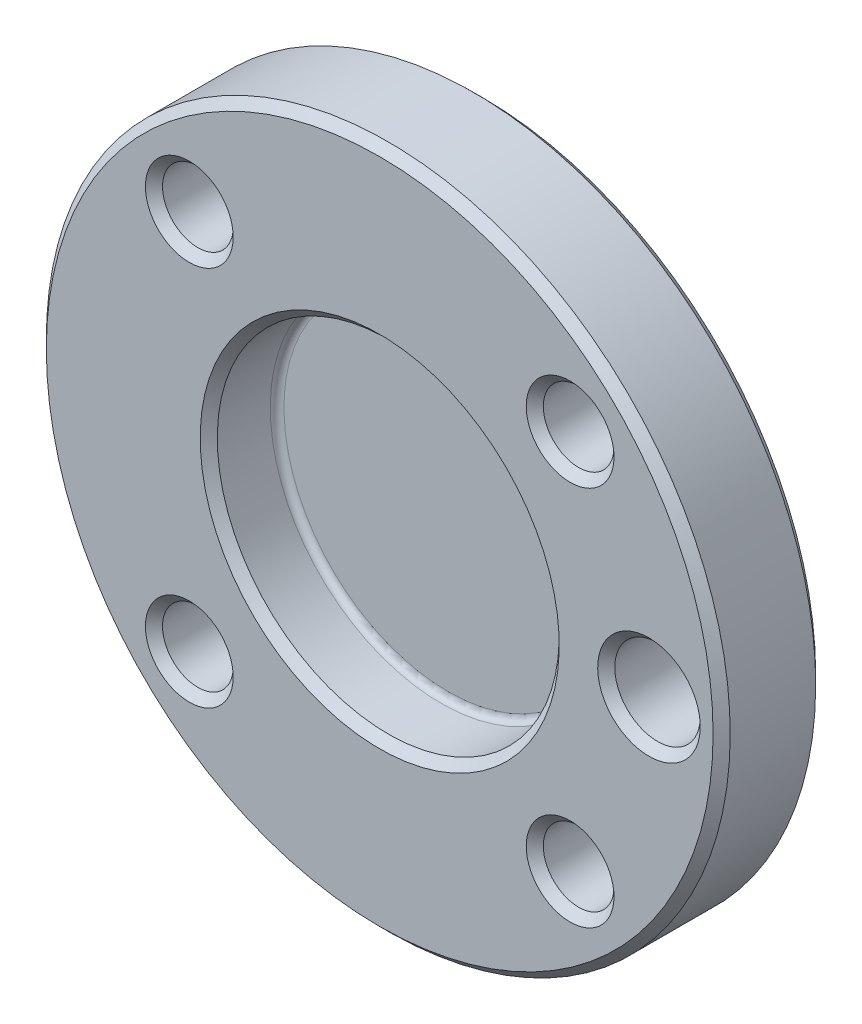
ISO-10303-21;
HEADER;
FILE_DESCRIPTION(('STEP AP214'),'2;1');
FILE_NAME('part.step','',(''),(''),'','','');
FILE_SCHEMA(('AUTOMOTIVE_DESIGN { 1 0 10303 214 1 1 1 1 }'));
ENDSEC;
DATA;
#1=APPLICATION_CONTEXT('core data for automotive mechanical design processes');
#2=APPLICATION_PROTOCOL_DEFINITION('international standard','automotive_design',2000,#1);
#3=PRODUCT_CONTEXT('',#1,'mechanical');
#4=PRODUCT('Part','Part','',(#3));
#5=PRODUCT_RELATED_PRODUCT_CATEGORY('part','',(#4));
#6=PRODUCT_DEFINITION_FORMATION('','',#4);
#7=PRODUCT_DEFINITION_CONTEXT('part definition',#1,'design');
#8=PRODUCT_DEFINITION('design','',#6,#7);
#9=PRODUCT_DEFINITION_SHAPE('','',#8);
#10=(LENGTH_UNIT() NAMED_UNIT(*) SI_UNIT(.MILLI.,.METRE.));
#11=(NAMED_UNIT(*) PLANE_ANGLE_UNIT() SI_UNIT($,.RADIAN.));
#12=(NAMED_UNIT(*) SI_UNIT($,.STERADIAN.) SOLID_ANGLE_UNIT());
#13=UNCERTAINTY_MEASURE_WITH_UNIT(LENGTH_MEASURE(1.E-05),#10,'distance_accuracy_value','');
#14=(GEOMETRIC_REPRESENTATION_CONTEXT(3) GLOBAL_UNCERTAINTY_ASSIGNED_CONTEXT((#13)) GLOBAL_UNIT_ASSIGNED_CONTEXT((#10,
#11,#12)) REPRESENTATION_CONTEXT('',''));
#15=CARTESIAN_POINT('',(0.,0.,0.));
#16=DIRECTION('',(0.,0.,1.));
#17=DIRECTION('',(1.,0.,0.));
#18=AXIS2_PLACEMENT_3D('',#15,#16,#17);
#19=CARTESIAN_POINT('',(0.909707985848987,13.9243598419,835.));
#20=DIRECTION('',(0.866025403784329,0.50000000000019,-1.31765538080944E-13));
#21=DIRECTION('',(-1.09967590589368E-13,0.,-1.));
#22=AXIS2_PLACEMENT_3D('',#19,#20,#21);
#23=PLANE('',#22);
#24=CARTESIAN_POINT('',(1.17164110942032E-05,15.5,829.));
#25=CARTESIAN_POINT('',(0.0959219726222836,15.3338785633,829.16612143672));
#26=CARTESIAN_POINT('',(0.191751851246081,15.1678963446,829.332810838));
#27=CARTESIAN_POINT('',(0.287493897063078,15.0020662568,829.5));
#28=(BOUNDED_CURVE() B_SPLINE_CURVE(3,(#24,#25,#26,#27),.UNSPECIFIED.,.F.,
.F.) B_SPLINE_CURVE_WITH_KNOTS((4,4),(0.,1.07758170709),
.UNSPECIFIED.) CURVE() GEOMETRIC_REPRESENTATION_ITEM() RATIONAL_B_SPLINE_CURVE((1.,1.,1.,1.)) REPRESENTATION_ITEM(''));
#29=CARTESIAN_POINT('',(1.17164110768879E-05,15.5,829.));
#30=VERTEX_POINT('',#29);
#31=CARTESIAN_POINT('',(0.287493897063078,15.0020662568,829.5));
#32=VERTEX_POINT('',#31);
#33=EDGE_CURVE('E247',#30,#32,#28,.T.);
#34=ORIENTED_EDGE('',*,*,#33,.T.);
#35=DIRECTION('',(0.,0.,-1.));
#36=VECTOR('',#35,1.);
#37=CARTESIAN_POINT('',(0.287493897063037,15.0020662568,832.));
#38=LINE('',#37,#36);
#39=CARTESIAN_POINT('',(0.287493897062996,15.0020662568,834.5));
#40=VERTEX_POINT('',#39);
#41=EDGE_CURVE('E170',#40,#32,#38,.T.);
#42=ORIENTED_EDGE('',*,*,#41,.F.);
#43=CARTESIAN_POINT('',(1.17164109889818E-05,15.5,835.));
#44=CARTESIAN_POINT('',(0.0959219726221904,15.3338785633,834.833878563275));
#45=CARTESIAN_POINT('',(0.191751851245993,15.1678963446,834.667189162003));
#46=CARTESIAN_POINT('',(0.287493897062996,15.0020662568,834.5));
#47=(BOUNDED_CURVE() B_SPLINE_CURVE(3,(#43,#44,#45,#46),.UNSPECIFIED.,.F.,
.F.) B_SPLINE_CURVE_WITH_KNOTS((4,4),(0.,1.07758170709),
.UNSPECIFIED.) CURVE() GEOMETRIC_REPRESENTATION_ITEM() RATIONAL_B_SPLINE_CURVE((1.,1.,1.,1.)) REPRESENTATION_ITEM(''));
#48=CARTESIAN_POINT('',(1.17164110062741E-05,15.5,835.));
#49=VERTEX_POINT('',#48);
#50=EDGE_CURVE('E201',#49,#40,#47,.T.);
#51=ORIENTED_EDGE('',*,*,#50,.F.);
#52=DIRECTION('',(0.,0.,-1.));
#53=VECTOR('',#52,1.);
#54=CARTESIAN_POINT('',(1.17164110388308E-05,15.5,832.));
#55=LINE('',#54,#53);
#56=EDGE_CURVE('E11',#49,#30,#55,.T.);
#57=ORIENTED_EDGE('',*,*,#56,.T.);
#58=EDGE_LOOP('',(#34,#42,#51,#57));
#59=FACE_BOUND('',#58,.T.);
#60=ADVANCED_FACE('F16',(#59),#23,.F.);
#61=CARTESIAN_POINT('',(1.17164109895369E-05,15.5,835.));
#62=DIRECTION('',(0.866025403784329,-0.50000000000019,-1.31680349954184E-13));
#63=DIRECTION('',(-1.09967590589368E-13,0.,-1.));
#64=AXIS2_PLACEMENT_3D('',#61,#62,#63);
#65=PLANE('',#64);
#66=ORIENTED_EDGE('',*,*,#56,.F.);
#67=CARTESIAN_POINT('',(1.17164110062458E-05,15.5,835.));
#68=CARTESIAN_POINT('',(-0.0958985398001096,15.3338785633,834.833878563275));
#69=CARTESIAN_POINT('',(-0.191728418424007,15.1678963446,834.667189162003));
#70=CARTESIAN_POINT('',(-0.287470464241004,15.0020662568,834.5));
#71=(BOUNDED_CURVE() B_SPLINE_CURVE(3,(#67,#68,#69,#70),.UNSPECIFIED.,.F.,
.F.) B_SPLINE_CURVE_WITH_KNOTS((4,4),(0.,1.07758170709),
.UNSPECIFIED.) CURVE() GEOMETRIC_REPRESENTATION_ITEM() RATIONAL_B_SPLINE_CURVE((1.,1.,1.,1.)) REPRESENTATION_ITEM(''));
#72=CARTESIAN_POINT('',(-0.287470464241004,15.0020662568,834.5));
#73=VERTEX_POINT('',#72);
#74=EDGE_CURVE('E207',#49,#73,#71,.T.);
#75=ORIENTED_EDGE('',*,*,#74,.T.);
#76=DIRECTION('',(0.,0.,-1.));
#77=VECTOR('',#76,1.);
#78=CARTESIAN_POINT('',(-0.287470464240963,15.0020662568,832.));
#79=LINE('',#78,#77);
#80=CARTESIAN_POINT('',(-0.287470464240922,15.0020662568,829.5));
#81=VERTEX_POINT('',#80);
#82=EDGE_CURVE('E171',#73,#81,#79,.T.);
#83=ORIENTED_EDGE('',*,*,#82,.T.);
#84=CARTESIAN_POINT('',(1.17164111115782E-05,15.5,829.));
#85=CARTESIAN_POINT('',(-0.0958985398000164,15.3338785633,829.16612143672));
#86=CARTESIAN_POINT('',(-0.19172841842392,15.1678963446,829.332810838));
#87=CARTESIAN_POINT('',(-0.287470464240922,15.0020662568,829.5));
#88=(BOUNDED_CURVE() B_SPLINE_CURVE(3,(#84,#85,#86,#87),.UNSPECIFIED.,.F.,
.F.) B_SPLINE_CURVE_WITH_KNOTS((4,4),(0.,1.07758170709),
.UNSPECIFIED.) CURVE() GEOMETRIC_REPRESENTATION_ITEM() RATIONAL_B_SPLINE_CURVE((1.,1.,1.,1.)) REPRESENTATION_ITEM(''));
#89=EDGE_CURVE('E248',#30,#81,#88,.T.);
#90=ORIENTED_EDGE('',*,*,#89,.F.);
#91=EDGE_LOOP('',(#66,#75,#83,#90));
#92=FACE_BOUND('',#91,.T.);
#93=ADVANCED_FACE('F279',(#92),#65,.T.);
#94=CARTESIAN_POINT('',(-19.4999882835889,35.,829.));
#95=DIRECTION('',(0.,0.,-1.));
#96=DIRECTION('',(-1.,0.,0.));
#97=AXIS2_PLACEMENT_3D('',#94,#95,#96);
#98=PLANE('',#97);
#99=CARTESIAN_POINT('',(-11.1369200872889,46.1369318037,829.));
#100=DIRECTION('',(0.,0.,-1.));
#101=DIRECTION('',(1.,0.,0.));
#102=AXIS2_PLACEMENT_3D('',#99,#100,#101);
#103=CIRCLE('',#102,2.067);
#104=CARTESIAN_POINT('',(-9.3229569318489,45.1459592154,829.));
#105=VERTEX_POINT('',#104);
#106=EDGE_CURVE('E180',#105,#105,#103,.T.);
#107=ORIENTED_EDGE('',*,*,#106,.F.);
#108=EDGE_LOOP('',(#107));
#109=FACE_BOUND('',#108,.T.);
#110=CARTESIAN_POINT('',(-11.1369200872889,23.8630681963,829.));
#111=DIRECTION('',(0.,0.,-1.));
#112=DIRECTION('',(1.,0.,0.));
#113=AXIS2_PLACEMENT_3D('',#110,#111,#112);
#114=CIRCLE('',#113,2.067);
#115=CARTESIAN_POINT('',(-10.1459474989889,25.67703135174,829.));
#116=VERTEX_POINT('',#115);
#117=EDGE_CURVE('E159',#116,#116,#114,.T.);
#118=ORIENTED_EDGE('',*,*,#117,.F.);
#119=EDGE_LOOP('',(#118));
#120=FACE_BOUND('',#119,.T.);
#121=CARTESIAN_POINT('',(11.1369435201111,23.8630681963,829.));
#122=DIRECTION('',(0.,0.,-1.));
#123=DIRECTION('',(1.,0.,0.));
#124=AXIS2_PLACEMENT_3D('',#121,#122,#123);
#125=CIRCLE('',#124,2.067);
#126=CARTESIAN_POINT('',(9.32298036467109,24.8540407846,829.));
#127=VERTEX_POINT('',#126);
#128=EDGE_CURVE('E149',#127,#127,#125,.T.);
#129=ORIENTED_EDGE('',*,*,#128,.F.);
#130=EDGE_LOOP('',(#129));
#131=FACE_BOUND('',#130,.T.);
#132=CARTESIAN_POINT('',(1.17164110926856E-05,35.,829.));
#133=DIRECTION('',(0.,0.,-1.));
#134=DIRECTION('',(1.,0.,0.));
#135=AXIS2_PLACEMENT_3D('',#132,#133,#134);
#136=CIRCLE('',#135,11.8);
#137=CARTESIAN_POINT('',(-10.3554625138889,40.65722135553,829.));
#138=VERTEX_POINT('',#137);
#139=EDGE_CURVE('E233',#138,#138,#136,.T.);
#140=ORIENTED_EDGE('',*,*,#139,.F.);
#141=EDGE_LOOP('',(#140));
#142=FACE_BOUND('',#141,.T.);
#143=CARTESIAN_POINT('',(11.1369435201111,46.1369318037,829.));
#144=DIRECTION('',(0.,0.,-1.));
#145=DIRECTION('',(1.,0.,0.));
#146=AXIS2_PLACEMENT_3D('',#143,#144,#145);
#147=CIRCLE('',#146,2.067);
#148=CARTESIAN_POINT('',(12.1279161084111,47.9508949591,829.));
#149=VERTEX_POINT('',#148);
#150=EDGE_CURVE('E162',#149,#149,#147,.T.);
#151=ORIENTED_EDGE('',*,*,#150,.F.);
#152=EDGE_LOOP('',(#151));
#153=FACE_BOUND('',#152,.T.);
#154=CARTESIAN_POINT('',(15.7500117164111,35.,829.));
#155=DIRECTION('',(0.,0.,-1.));
#156=DIRECTION('',(1.,0.,0.));
#157=AXIS2_PLACEMENT_3D('',#154,#155,#156);
#158=CIRCLE('',#157,2.);
#159=CARTESIAN_POINT('',(14.7911606392111,33.24483487622,829.));
#160=VERTEX_POINT('',#159);
#161=EDGE_CURVE('E238',#160,#160,#158,.T.);
#162=ORIENTED_EDGE('',*,*,#161,.F.);
#163=EDGE_LOOP('',(#162));
#164=FACE_BOUND('',#163,.T.);
#165=CARTESIAN_POINT('',(1.17164110926856E-05,35.,829.));
#166=DIRECTION('',(0.,0.,-1.));
#167=DIRECTION('',(1.,0.,0.));
#168=AXIS2_PLACEMENT_3D('',#165,#166,#167);
#169=CIRCLE('',#168,19.5);
#170=EDGE_CURVE('E189',#30,#30,#169,.T.);
#171=ORIENTED_EDGE('',*,*,#170,.T.);
#172=EDGE_LOOP('',(#171));
#173=FACE_BOUND('',#172,.T.);
#174=ADVANCED_FACE('F276',(#109,#120,#131,#142,#153,#164,#173),#98,.T.);
#175=CARTESIAN_POINT('',(-10.499988283589,35.,835.));
#176=DIRECTION('',(0.,0.,-1.));
#177=DIRECTION('',(-1.,0.,0.));
#178=AXIS2_PLACEMENT_3D('',#175,#176,#177);
#179=PLANE('',#178);
#180=CARTESIAN_POINT('',(-11.136920087289,46.1369318037,835.));
#181=DIRECTION('',(0.,0.,-1.));
#182=DIRECTION('',(1.,0.,0.));
#183=AXIS2_PLACEMENT_3D('',#180,#181,#182);
#184=CIRCLE('',#183,2.567);
#185=CARTESIAN_POINT('',(-8.884165650909,44.90624644609,835.));
#186=VERTEX_POINT('',#185);
#187=EDGE_CURVE('E214',#186,#186,#184,.T.);
#188=ORIENTED_EDGE('',*,*,#187,.T.);
#189=EDGE_LOOP('',(#188));
#190=FACE_BOUND('',#189,.T.);
#191=CARTESIAN_POINT('',(-11.136920087289,23.8630681963,835.));
#192=DIRECTION('',(0.,0.,-1.));
#193=DIRECTION('',(1.,0.,0.));
#194=AXIS2_PLACEMENT_3D('',#191,#192,#193);
#195=CIRCLE('',#194,2.567);
#196=CARTESIAN_POINT('',(-9.90623472967901,26.11582263268,835.));
#197=VERTEX_POINT('',#196);
#198=EDGE_CURVE('E195',#197,#197,#195,.T.);
#199=ORIENTED_EDGE('',*,*,#198,.T.);
#200=EDGE_LOOP('',(#199));
#201=FACE_BOUND('',#200,.T.);
#202=CARTESIAN_POINT('',(11.136943520111,23.8630681963,835.));
#203=DIRECTION('',(0.,0.,-1.));
#204=DIRECTION('',(1.,0.,0.));
#205=AXIS2_PLACEMENT_3D('',#202,#203,#204);
#206=CIRCLE('',#205,2.567);
#207=CARTESIAN_POINT('',(8.88418908373099,25.09375355391,835.));
#208=VERTEX_POINT('',#207);
#209=EDGE_CURVE('E184',#208,#208,#206,.T.);
#210=ORIENTED_EDGE('',*,*,#209,.T.);
#211=EDGE_LOOP('',(#210));
#212=FACE_BOUND('',#211,.T.);
#213=CARTESIAN_POINT('',(1.17164109952E-05,35.,835.));
#214=DIRECTION('',(0.,0.,-1.));
#215=DIRECTION('',(1.,0.,0.));
#216=AXIS2_PLACEMENT_3D('',#213,#214,#215);
#217=CIRCLE('',#216,10.5);
#218=CARTESIAN_POINT('',(9.21462861626099,29.96603184466,835.));
#219=VERTEX_POINT('',#218);
#220=EDGE_CURVE('E172',#219,#219,#217,.T.);
#221=ORIENTED_EDGE('',*,*,#220,.T.);
#222=EDGE_LOOP('',(#221));
#223=FACE_BOUND('',#222,.T.);
#224=CARTESIAN_POINT('',(11.136943520111,46.1369318037,835.));
#225=DIRECTION('',(0.,0.,-1.));
#226=DIRECTION('',(1.,0.,0.));
#227=AXIS2_PLACEMENT_3D('',#224,#225,#226);
#228=CIRCLE('',#227,2.567);
#229=CARTESIAN_POINT('',(12.367628877711,48.3896862401,835.));
#230=VERTEX_POINT('',#229);
#231=EDGE_CURVE('E181',#230,#230,#228,.T.);
#232=ORIENTED_EDGE('',*,*,#231,.T.);
#233=EDGE_LOOP('',(#232));
#234=FACE_BOUND('',#233,.T.);
#235=CARTESIAN_POINT('',(15.750011716411,35.0000000000007,835.));
#236=DIRECTION('',(-5.430970312756E-13,6.1568736955224E-13,-1.));
#237=DIRECTION('',(1.,0.,-5.430970312756E-13));
#238=AXIS2_PLACEMENT_3D('',#235,#236,#237);
#239=CIRCLE('',#238,3.);
#240=CARTESIAN_POINT('',(17.188286756911,37.63274445068,835.));
#241=VERTEX_POINT('',#240);
#242=EDGE_CURVE('E185',#241,#241,#239,.T.);
#243=ORIENTED_EDGE('',*,*,#242,.T.);
#244=EDGE_LOOP('',(#243));
#245=FACE_BOUND('',#244,.T.);
#246=CARTESIAN_POINT('',(1.17164109969764E-05,35.,835.));
#247=DIRECTION('',(0.,0.,-1.));
#248=DIRECTION('',(1.,0.,0.));
#249=AXIS2_PLACEMENT_3D('',#246,#247,#248);
#250=CIRCLE('',#249,19.5);
#251=EDGE_CURVE('E206',#49,#49,#250,.T.);
#252=ORIENTED_EDGE('',*,*,#251,.F.);
#253=EDGE_LOOP('',(#252));
#254=FACE_BOUND('',#253,.T.);
#255=ADVANCED_FACE('F278',(#190,#201,#212,#223,#234,#245,#254),#179,.F.);
#256=CARTESIAN_POINT('',(-9.59998828358894,35.,831.));
#257=DIRECTION('',(0.,0.,-1.));
#258=DIRECTION('',(-1.,0.,0.));
#259=AXIS2_PLACEMENT_3D('',#256,#257,#258);
#260=PLANE('',#259);
#261=CARTESIAN_POINT('',(1.17164110601904E-05,35.,831.));
#262=DIRECTION('',(0.,0.,-1.));
#263=DIRECTION('',(1.,0.,0.));
#264=AXIS2_PLACEMENT_3D('',#261,#262,#263);
#265=CIRCLE('',#264,9.6);
#266=CARTESIAN_POINT('',(8.42480431056106,30.3975148294,831.));
#267=VERTEX_POINT('',#266);
#268=EDGE_CURVE('E27',#267,#267,#265,.T.);
#269=ORIENTED_EDGE('',*,*,#268,.F.);
#270=EDGE_LOOP('',(#269));
#271=FACE_BOUND('',#270,.T.);
#272=ADVANCED_FACE('F350',(#271),#260,.F.);
#273=CARTESIAN_POINT('',(1.17164110536914E-05,35.,831.4));
#274=DIRECTION('',(0.,0.,-1.));
#275=DIRECTION('',(-0.877582561890372,0.479425538604204,0.));
#276=AXIS2_PLACEMENT_3D('',#273,#274,#275);
#277=TOROIDAL_SURFACE('',#276,9.6,0.4);
#278=CARTESIAN_POINT('',(1.17164110536914E-05,35.,831.4));
#279=DIRECTION('',(0.,0.,-1.));
#280=DIRECTION('',(1.,0.,0.));
#281=AXIS2_PLACEMENT_3D('',#278,#279,#280);
#282=CIRCLE('',#281,10.);
#283=CARTESIAN_POINT('',(8.77583733531105,30.20574461396,831.4));
#284=VERTEX_POINT('',#283);
#285=EDGE_CURVE('E175',#284,#284,#282,.T.);
#286=ORIENTED_EDGE('',*,*,#285,.F.);
#287=EDGE_LOOP('',(#286));
#288=FACE_BOUND('',#287,.T.);
#289=ORIENTED_EDGE('',*,*,#268,.T.);
#290=EDGE_LOOP('',(#289));
#291=FACE_BOUND('',#290,.T.);
#292=ADVANCED_FACE('F353',(#288,#291),#277,.F.);
#293=CARTESIAN_POINT('',(1.17164111885465E-05,35.,823.1000000004));
#294=DIRECTION('',(0.,0.,-1.));
#295=DIRECTION('',(-0.877582561890372,0.479425538604204,0.));
#296=AXIS2_PLACEMENT_3D('',#293,#294,#295);
#297=CYLINDRICAL_SURFACE('',#296,10.);
#298=CARTESIAN_POINT('',(1.17164110033238E-05,35.,834.5));
#299=DIRECTION('',(0.,0.,-1.));
#300=DIRECTION('',(1.,0.,0.));
#301=AXIS2_PLACEMENT_3D('',#298,#299,#300);
#302=CIRCLE('',#301,10.);
#303=CARTESIAN_POINT('',(8.775837335311,30.20574461396,834.5));
#304=VERTEX_POINT('',#303);
#305=EDGE_CURVE('E176',#304,#304,#302,.T.);
#306=ORIENTED_EDGE('',*,*,#305,.F.);
#307=EDGE_LOOP('',(#306));
#308=FACE_BOUND('',#307,.T.);
#309=ORIENTED_EDGE('',*,*,#285,.T.);
#310=EDGE_LOOP('',(#309));
#311=FACE_BOUND('',#310,.T.);
#312=ADVANCED_FACE('F366',(#308,#311),#297,.F.);
#313=CARTESIAN_POINT('',(1.17164110033238E-05,35.,834.5));
#314=DIRECTION('',(0.,0.,1.));
#315=DIRECTION('',(0.877582561890372,-0.479425538604204,0.));
#316=AXIS2_PLACEMENT_3D('',#313,#314,#315);
#317=CONICAL_SURFACE('',#316,10.,0.785398163397);
#318=ORIENTED_EDGE('',*,*,#220,.F.);
#319=EDGE_LOOP('',(#318));
#320=FACE_BOUND('',#319,.T.);
#321=ORIENTED_EDGE('',*,*,#305,.T.);
#322=EDGE_LOOP('',(#321));
#323=FACE_BOUND('',#322,.T.);
#324=ADVANCED_FACE('F368',(#320,#323),#317,.F.);
#325=CARTESIAN_POINT('',(1.17164109952E-05,35.,835.));
#326=DIRECTION('',(0.,0.,-1.));
#327=DIRECTION('',(0.877582561890372,-0.479425538604204,0.));
#328=AXIS2_PLACEMENT_3D('',#325,#326,#327);
#329=CONICAL_SURFACE('',#328,19.5,0.785398163397);
#330=CARTESIAN_POINT('',(1.17164110033238E-05,35.,834.5));
#331=DIRECTION('',(0.,0.,-1.));
#332=DIRECTION('',(1.,0.,0.));
#333=AXIS2_PLACEMENT_3D('',#330,#331,#332);
#334=CIRCLE('',#333,20.);
#335=EDGE_CURVE('E167',#73,#40,#334,.T.);
#336=ORIENTED_EDGE('',*,*,#335,.F.);
#337=ORIENTED_EDGE('',*,*,#74,.F.);
#338=ORIENTED_EDGE('',*,*,#251,.T.);
#339=ORIENTED_EDGE('',*,*,#50,.T.);
#340=EDGE_LOOP('',(#336,#337,#338,#339));
#341=FACE_BOUND('',#340,.T.);
#342=ADVANCED_FACE('F413',(#341),#329,.T.);
#343=CARTESIAN_POINT('',(-11.136920087289,46.1369318037,834.5));
#344=DIRECTION('',(0.,0.,1.));
#345=DIRECTION('',(-0.877582561890372,0.479425538604204,0.));
#346=AXIS2_PLACEMENT_3D('',#343,#344,#345);
#347=CONICAL_SURFACE('',#346,2.067,0.785398163397);
#348=CARTESIAN_POINT('',(-11.136920087289,46.1369318037,834.5));
#349=DIRECTION('',(0.,0.,-1.));
#350=DIRECTION('',(1.,0.,0.));
#351=AXIS2_PLACEMENT_3D('',#348,#349,#350);
#352=CIRCLE('',#351,2.067);
#353=CARTESIAN_POINT('',(-12.950883242689,47.127904392,834.5));
#354=VERTEX_POINT('',#353);
#355=EDGE_CURVE('E191',#354,#354,#352,.T.);
#356=ORIENTED_EDGE('',*,*,#355,.T.);
#357=EDGE_LOOP('',(#356));
#358=FACE_BOUND('',#357,.T.);
#359=ORIENTED_EDGE('',*,*,#187,.F.);
#360=EDGE_LOOP('',(#359));
#361=FACE_BOUND('',#360,.T.);
#362=ADVANCED_FACE('F364',(#358,#361),#347,.F.);
#363=CARTESIAN_POINT('',(-11.136920087289,23.8630681963,834.5));
#364=DIRECTION('',(0.,0.,1.));
#365=DIRECTION('',(-0.479425538604204,-0.877582561890372,0.));
#366=AXIS2_PLACEMENT_3D('',#363,#364,#365);
#367=CONICAL_SURFACE('',#366,2.067,0.785398163397);
#368=CARTESIAN_POINT('',(-11.136920087289,23.8630681963,834.5));
#369=DIRECTION('',(0.,0.,-1.));
#370=DIRECTION('',(1.,0.,0.));
#371=AXIS2_PLACEMENT_3D('',#368,#369,#370);
#372=CIRCLE('',#371,2.067);
#373=CARTESIAN_POINT('',(-12.127892675589,22.0491050409,834.5));
#374=VERTEX_POINT('',#373);
#375=EDGE_CURVE('E177',#374,#374,#372,.T.);
#376=ORIENTED_EDGE('',*,*,#375,.T.);
#377=EDGE_LOOP('',(#376));
#378=FACE_BOUND('',#377,.T.);
#379=ORIENTED_EDGE('',*,*,#198,.F.);
#380=EDGE_LOOP('',(#379));
#381=FACE_BOUND('',#380,.T.);
#382=ADVANCED_FACE('F360',(#378,#381),#367,.F.);
#383=CARTESIAN_POINT('',(11.136943520111,23.8630681963,834.5));
#384=DIRECTION('',(0.,0.,1.));
#385=DIRECTION('',(0.877582561890372,-0.479425538604204,0.));
#386=AXIS2_PLACEMENT_3D('',#383,#384,#385);
#387=CONICAL_SURFACE('',#386,2.067,0.785398163397);
#388=CARTESIAN_POINT('',(11.136943520111,23.8630681963,834.5));
#389=DIRECTION('',(0.,0.,-1.));
#390=DIRECTION('',(1.,0.,0.));
#391=AXIS2_PLACEMENT_3D('',#388,#389,#390);
#392=CIRCLE('',#391,2.067);
#393=CARTESIAN_POINT('',(12.950906675511,22.872095608,834.5));
#394=VERTEX_POINT('',#393);
#395=EDGE_CURVE('E153',#394,#394,#392,.T.);
#396=ORIENTED_EDGE('',*,*,#395,.T.);
#397=EDGE_LOOP('',(#396));
#398=FACE_BOUND('',#397,.T.);
#399=ORIENTED_EDGE('',*,*,#209,.F.);
#400=EDGE_LOOP('',(#399));
#401=FACE_BOUND('',#400,.T.);
#402=ADVANCED_FACE('F363',(#398,#401),#387,.F.);
#403=CARTESIAN_POINT('',(11.136943520111,46.1369318037,834.5));
#404=DIRECTION('',(0.,0.,1.));
#405=DIRECTION('',(-0.479425538604204,-0.877582561890372,0.));
#406=AXIS2_PLACEMENT_3D('',#403,#404,#405);
#407=CONICAL_SURFACE('',#406,2.067,0.785398163397);
#408=CARTESIAN_POINT('',(11.136943520111,46.1369318037,834.5));
#409=DIRECTION('',(0.,0.,-1.));
#410=DIRECTION('',(1.,0.,0.));
#411=AXIS2_PLACEMENT_3D('',#408,#409,#410);
#412=CIRCLE('',#411,2.067);
#413=CARTESIAN_POINT('',(10.145970931811,44.32296864826,834.5));
#414=VERTEX_POINT('',#413);
#415=EDGE_CURVE('E20',#414,#414,#412,.T.);
#416=ORIENTED_EDGE('',*,*,#415,.T.);
#417=EDGE_LOOP('',(#416));
#418=FACE_BOUND('',#417,.T.);
#419=ORIENTED_EDGE('',*,*,#231,.F.);
#420=EDGE_LOOP('',(#419));
#421=FACE_BOUND('',#420,.T.);
#422=ADVANCED_FACE('F388',(#418,#421),#407,.F.);
#423=CARTESIAN_POINT('',(15.7500117164137,34.9999999999981,833.));
#424=DIRECTION('',(2.65537961785117E-12,1.30301828255775E-12,1.));
#425=DIRECTION('',(0.479425538604974,0.877582561889952,-2.41656292608544E-12));
#426=AXIS2_PLACEMENT_3D('',#423,#424,#425);
#427=CONICAL_SURFACE('',#426,0.999999999997103,0.785398163396);
#428=CARTESIAN_POINT('',(15.750011716411,35.,834.5));
#429=DIRECTION('',(0.,0.,-1.));
#430=DIRECTION('',(1.,0.,0.));
#431=AXIS2_PLACEMENT_3D('',#428,#429,#430);
#432=CIRCLE('',#431,2.5);
#433=CARTESIAN_POINT('',(16.948575562911,37.19395640473,834.5));
#434=VERTEX_POINT('',#433);
#435=EDGE_CURVE('E165',#434,#434,#432,.T.);
#436=ORIENTED_EDGE('',*,*,#435,.T.);
#437=EDGE_LOOP('',(#436));
#438=FACE_BOUND('',#437,.T.);
#439=ORIENTED_EDGE('',*,*,#242,.F.);
#440=EDGE_LOOP('',(#439));
#441=FACE_BOUND('',#440,.T.);
#442=ADVANCED_FACE('F323',(#438,#441),#427,.F.);
#443=CARTESIAN_POINT('',(1.17164111885465E-05,35.,823.1000000004));
#444=DIRECTION('',(0.,0.,-1.));
#445=DIRECTION('',(0.877582561890372,-0.479425538604204,0.));
#446=AXIS2_PLACEMENT_3D('',#443,#444,#445);
#447=CYLINDRICAL_SURFACE('',#446,20.);
#448=CARTESIAN_POINT('',(1.17164110845618E-05,35.,829.5));
#449=DIRECTION('',(0.,0.,-1.));
#450=DIRECTION('',(1.,0.,0.));
#451=AXIS2_PLACEMENT_3D('',#448,#449,#450);
#452=CIRCLE('',#451,20.);
#453=EDGE_CURVE('E243',#81,#32,#452,.T.);
#454=ORIENTED_EDGE('',*,*,#453,.F.);
#455=ORIENTED_EDGE('',*,*,#82,.F.);
#456=ORIENTED_EDGE('',*,*,#335,.T.);
#457=ORIENTED_EDGE('',*,*,#41,.T.);
#458=EDGE_LOOP('',(#454,#455,#456,#457));
#459=FACE_BOUND('',#458,.T.);
#460=ADVANCED_FACE('F399',(#459),#447,.T.);
#461=CARTESIAN_POINT('',(-11.136920087289,46.1369318037,834.9));
#462=DIRECTION('',(0.,0.,-1.));
#463=DIRECTION('',(0.877582561890372,-0.479425538604204,0.));
#464=AXIS2_PLACEMENT_3D('',#461,#462,#463);
#465=CYLINDRICAL_SURFACE('',#464,2.067);
#466=ORIENTED_EDGE('',*,*,#355,.F.);
#467=EDGE_LOOP('',(#466));
#468=FACE_BOUND('',#467,.T.);
#469=ORIENTED_EDGE('',*,*,#106,.T.);
#470=EDGE_LOOP('',(#469));
#471=FACE_BOUND('',#470,.T.);
#472=ADVANCED_FACE('F397',(#468,#471),#465,.F.);
#473=CARTESIAN_POINT('',(-11.136920087289,23.8630681963,834.9));
#474=DIRECTION('',(0.,0.,-1.));
#475=DIRECTION('',(0.479425538604204,0.877582561890372,0.));
#476=AXIS2_PLACEMENT_3D('',#473,#474,#475);
#477=CYLINDRICAL_SURFACE('',#476,2.067);
#478=ORIENTED_EDGE('',*,*,#375,.F.);
#479=EDGE_LOOP('',(#478));
#480=FACE_BOUND('',#479,.T.);
#481=ORIENTED_EDGE('',*,*,#117,.T.);
#482=EDGE_LOOP('',(#481));
#483=FACE_BOUND('',#482,.T.);
#484=ADVANCED_FACE('F18',(#480,#483),#477,.F.);
#485=CARTESIAN_POINT('',(11.136943520111,23.8630681963,834.9));
#486=DIRECTION('',(0.,0.,-1.));
#487=DIRECTION('',(-0.877582561890372,0.479425538604204,0.));
#488=AXIS2_PLACEMENT_3D('',#485,#486,#487);
#489=CYLINDRICAL_SURFACE('',#488,2.067);
#490=ORIENTED_EDGE('',*,*,#395,.F.);
#491=EDGE_LOOP('',(#490));
#492=FACE_BOUND('',#491,.T.);
#493=ORIENTED_EDGE('',*,*,#128,.T.);
#494=EDGE_LOOP('',(#493));
#495=FACE_BOUND('',#494,.T.);
#496=ADVANCED_FACE('F150',(#492,#495),#489,.F.);
#497=CARTESIAN_POINT('',(11.136943520111,46.1369318037,834.9));
#498=DIRECTION('',(0.,0.,-1.));
#499=DIRECTION('',(0.479425538604204,0.877582561890372,0.));
#500=AXIS2_PLACEMENT_3D('',#497,#498,#499);
#501=CYLINDRICAL_SURFACE('',#500,2.067);
#502=ORIENTED_EDGE('',*,*,#415,.F.);
#503=EDGE_LOOP('',(#502));
#504=FACE_BOUND('',#503,.T.);
#505=ORIENTED_EDGE('',*,*,#150,.T.);
#506=EDGE_LOOP('',(#505));
#507=FACE_BOUND('',#506,.T.);
#508=ADVANCED_FACE('F328',(#504,#507),#501,.F.);
#509=CARTESIAN_POINT('',(15.750011716411,35.,834.9));
#510=DIRECTION('',(0.,0.,-1.));
#511=DIRECTION('',(0.479425538604204,0.877582561890372,0.));
#512=AXIS2_PLACEMENT_3D('',#509,#510,#511);
#513=CYLINDRICAL_SURFACE('',#512,2.5);
#514=CARTESIAN_POINT('',(15.7500117164111,35.,830.));
#515=DIRECTION('',(0.,0.,-1.));
#516=DIRECTION('',(1.,0.,0.));
#517=AXIS2_PLACEMENT_3D('',#514,#515,#516);
#518=CIRCLE('',#517,2.5);
#519=CARTESIAN_POINT('',(16.9485755629111,37.19395640473,830.));
#520=VERTEX_POINT('',#519);
#521=EDGE_CURVE('E186',#520,#520,#518,.T.);
#522=ORIENTED_EDGE('',*,*,#521,.T.);
#523=EDGE_LOOP('',(#522));
#524=FACE_BOUND('',#523,.T.);
#525=ORIENTED_EDGE('',*,*,#435,.F.);
#526=EDGE_LOOP('',(#525));
#527=FACE_BOUND('',#526,.T.);
#528=ADVANCED_FACE('F326',(#524,#527),#513,.F.);
#529=CARTESIAN_POINT('',(1.17164110926856E-05,35.,829.));
#530=DIRECTION('',(0.,0.,1.));
#531=DIRECTION('',(-6.2828960994005E-12,-1.,0.));
#532=AXIS2_PLACEMENT_3D('',#529,#530,#531);
#533=CONICAL_SURFACE('',#532,19.5,0.785398163397);
#534=ORIENTED_EDGE('',*,*,#170,.F.);
#535=ORIENTED_EDGE('',*,*,#89,.T.);
#536=ORIENTED_EDGE('',*,*,#453,.T.);
#537=ORIENTED_EDGE('',*,*,#33,.F.);
#538=EDGE_LOOP('',(#534,#535,#536,#537));
#539=FACE_BOUND('',#538,.T.);
#540=ADVANCED_FACE('F292',(#539),#533,.T.);
#541=CARTESIAN_POINT('',(15.7500117164111,33.,830.));
#542=DIRECTION('',(0.,0.,-1.));
#543=DIRECTION('',(-1.,0.,0.));
#544=AXIS2_PLACEMENT_3D('',#541,#542,#543);
#545=PLANE('',#544);
#546=CARTESIAN_POINT('',(15.7500117164111,35.,830.));
#547=DIRECTION('',(0.,0.,-1.));
#548=DIRECTION('',(1.,0.,0.));
#549=AXIS2_PLACEMENT_3D('',#546,#547,#548);
#550=CIRCLE('',#549,2.);
#551=CARTESIAN_POINT('',(16.7088627936111,36.75516512378,830.));
#552=VERTEX_POINT('',#551);
#553=EDGE_CURVE('E190',#552,#552,#550,.T.);
#554=ORIENTED_EDGE('',*,*,#553,.T.);
#555=EDGE_LOOP('',(#554));
#556=FACE_BOUND('',#555,.T.);
#557=ORIENTED_EDGE('',*,*,#521,.F.);
#558=EDGE_LOOP('',(#557));
#559=FACE_BOUND('',#558,.T.);
#560=ADVANCED_FACE('F336',(#556,#559),#545,.F.);
#561=CARTESIAN_POINT('',(15.750011716411,35.,834.9));
#562=DIRECTION('',(0.,0.,-1.));
#563=DIRECTION('',(-0.479425538604204,-0.877582561890372,0.));
#564=AXIS2_PLACEMENT_3D('',#561,#562,#563);
#565=CYLINDRICAL_SURFACE('',#564,2.);
#566=ORIENTED_EDGE('',*,*,#553,.F.);
#567=EDGE_LOOP('',(#566));
#568=FACE_BOUND('',#567,.T.);
#569=ORIENTED_EDGE('',*,*,#161,.T.);
#570=EDGE_LOOP('',(#569));
#571=FACE_BOUND('',#570,.T.);
#572=ADVANCED_FACE('F355',(#568,#571),#565,.F.);
#573=CARTESIAN_POINT('',(1.17164111056837E-05,35.,828.2));
#574=DIRECTION('',(0.,0.,-1.));
#575=DIRECTION('',(0.877582561890372,-0.479425538604204,0.));
#576=AXIS2_PLACEMENT_3D('',#573,#574,#575);
#577=TOROIDAL_SURFACE('',#576,11.8,0.8);
#578=CARTESIAN_POINT('',(1.17164111056837E-05,35.,828.2));
#579=DIRECTION('',(0.,0.,-1.));
#580=DIRECTION('',(1.,0.,0.));
#581=AXIS2_PLACEMENT_3D('',#578,#579,#580);
#582=CIRCLE('',#581,11.);
#583=CARTESIAN_POINT('',(-9.65339646437889,40.27368092465,828.2));
#584=VERTEX_POINT('',#583);
#585=EDGE_CURVE('E255',#584,#584,#582,.T.);
#586=ORIENTED_EDGE('',*,*,#585,.F.);
#587=EDGE_LOOP('',(#586));
#588=FACE_BOUND('',#587,.T.);
#589=ORIENTED_EDGE('',*,*,#139,.T.);
#590=EDGE_LOOP('',(#589));
#591=FACE_BOUND('',#590,.T.);
#592=ADVANCED_FACE('F358',(#588,#591),#577,.F.);
#593=CARTESIAN_POINT('',(1.17164111885465E-05,35.,823.1000000004));
#594=DIRECTION('',(0.,0.,-1.));
#595=DIRECTION('',(-0.877582561890372,0.479425538604204,0.));
#596=AXIS2_PLACEMENT_3D('',#593,#594,#595);
#597=CYLINDRICAL_SURFACE('',#596,11.);
#598=ORIENTED_EDGE('',*,*,#585,.T.);
#599=EDGE_LOOP('',(#598));
#600=FACE_BOUND('',#599,.T.);
#601=CARTESIAN_POINT('',(1.17164111417209E-05,35.,825.9));
#602=DIRECTION('',(0.,0.,1.));
#603=DIRECTION('',(1.,0.,0.));
#604=AXIS2_PLACEMENT_3D('',#601,#602,#603);
#605=CIRCLE('',#604,11.);
#606=CARTESIAN_POINT('',(-9.65339646437885,40.27368092465,825.9));
#607=VERTEX_POINT('',#606);
#608=EDGE_CURVE('E261',#607,#607,#605,.T.);
#609=ORIENTED_EDGE('',*,*,#608,.T.);
#610=EDGE_LOOP('',(#609));
#611=FACE_BOUND('',#610,.T.);
#612=ADVANCED_FACE('F348',(#600,#611),#597,.T.);
#613=CARTESIAN_POINT('',(1.1716411133874E-05,18.7595863342,825.9));
#614=DIRECTION('',(0.,0.,1.));
#615=DIRECTION('',(1.,0.,0.));
#616=AXIS2_PLACEMENT_3D('',#613,#614,#615);
#617=PLANE('',#616);
#618=ORIENTED_EDGE('',*,*,#608,.F.);
#619=EDGE_LOOP('',(#618));
#620=FACE_BOUND('',#619,.T.);
#621=ADVANCED_FACE('F370',(#620),#617,.F.);
#622=CLOSED_SHELL('',(#60,#93,#174,#255,#272,#292,#312,#324,#342,#362,#382,#402,#422,#442,#460,
#472,#484,#496,#508,#528,#540,#560,#572,#592,#612,#621));
#623=MANIFOLD_SOLID_BREP('B1',#622);
#624=ADVANCED_BREP_SHAPE_REPRESENTATION('',(#18,#623),#14);
#625=SHAPE_DEFINITION_REPRESENTATION(#9,#624);
ENDSEC;
END-ISO-10303-21;
